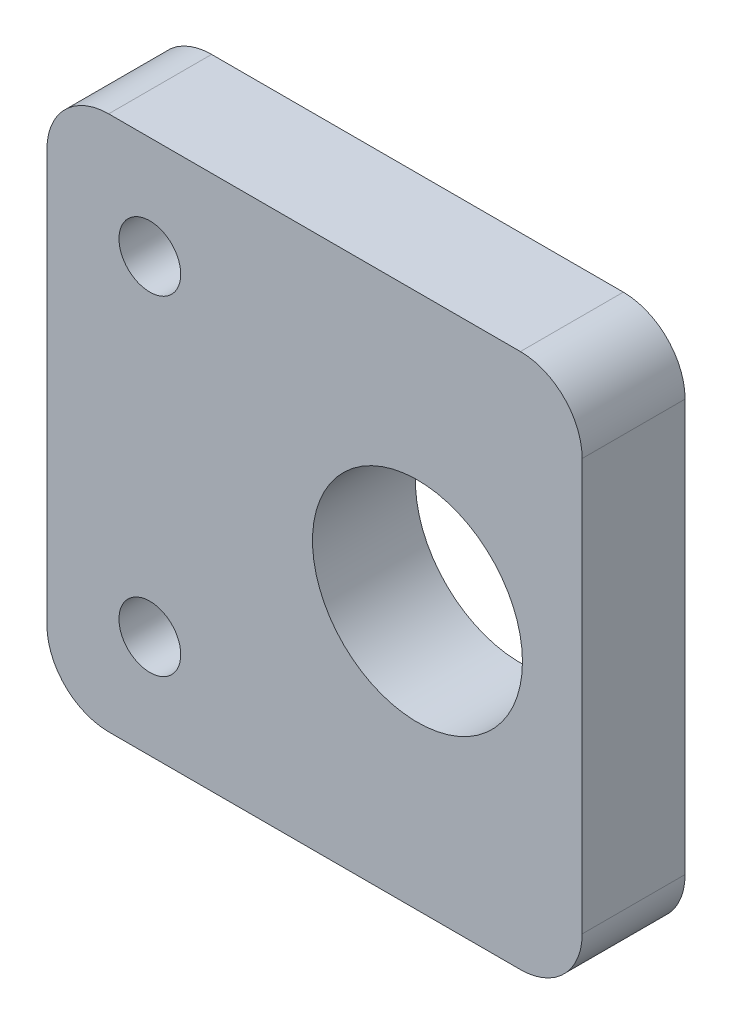
ISO-10303-21;
HEADER;
FILE_DESCRIPTION(('STEP AP214'),'2;1');
FILE_NAME('part.step','',(''),(''),'','','');
FILE_SCHEMA(('AUTOMOTIVE_DESIGN { 1 0 10303 214 1 1 1 1 }'));
ENDSEC;
DATA;
#1=APPLICATION_CONTEXT('core data for automotive mechanical design processes');
#2=APPLICATION_PROTOCOL_DEFINITION('international standard','automotive_design',2000,#1);
#3=PRODUCT_CONTEXT('',#1,'mechanical');
#4=PRODUCT('Part','Part','',(#3));
#5=PRODUCT_RELATED_PRODUCT_CATEGORY('part','',(#4));
#6=PRODUCT_DEFINITION_FORMATION('','',#4);
#7=PRODUCT_DEFINITION_CONTEXT('part definition',#1,'design');
#8=PRODUCT_DEFINITION('design','',#6,#7);
#9=PRODUCT_DEFINITION_SHAPE('','',#8);
#10=(LENGTH_UNIT() NAMED_UNIT(*) SI_UNIT(.MILLI.,.METRE.));
#11=(NAMED_UNIT(*) PLANE_ANGLE_UNIT() SI_UNIT($,.RADIAN.));
#12=(NAMED_UNIT(*) SI_UNIT($,.STERADIAN.) SOLID_ANGLE_UNIT());
#13=UNCERTAINTY_MEASURE_WITH_UNIT(LENGTH_MEASURE(1.E-05),#10,'distance_accuracy_value','');
#14=(GEOMETRIC_REPRESENTATION_CONTEXT(3) GLOBAL_UNCERTAINTY_ASSIGNED_CONTEXT((#13)) GLOBAL_UNIT_ASSIGNED_CONTEXT((#10,
#11,#12)) REPRESENTATION_CONTEXT('',''));
#15=CARTESIAN_POINT('',(0.,0.,0.));
#16=DIRECTION('',(0.,0.,1.));
#17=DIRECTION('',(1.,0.,0.));
#18=AXIS2_PLACEMENT_3D('',#15,#16,#17);
#19=CARTESIAN_POINT('',(0.,-13.,5.));
#20=DIRECTION('',(0.,1.,0.));
#21=DIRECTION('',(0.,0.,1.));
#22=AXIS2_PLACEMENT_3D('',#19,#20,#21);
#23=PLANE('',#22);
#24=DIRECTION('',(1.,0.,0.));
#25=VECTOR('',#24,1.);
#26=CARTESIAN_POINT('',(0.,-13.,5.));
#27=LINE('',#26,#25);
#28=CARTESIAN_POINT('',(-15.,-13.,5.));
#29=VERTEX_POINT('',#28);
#30=CARTESIAN_POINT('',(5.,-13.,5.));
#31=VERTEX_POINT('',#30);
#32=EDGE_CURVE('E121',#29,#31,#27,.T.);
#33=ORIENTED_EDGE('',*,*,#32,.F.);
#34=DIRECTION('',(0.,0.,-1.));
#35=VECTOR('',#34,1.);
#36=CARTESIAN_POINT('',(-15.,-13.,0.));
#37=LINE('',#36,#35);
#38=CARTESIAN_POINT('',(-15.,-13.,0.));
#39=VERTEX_POINT('',#38);
#40=EDGE_CURVE('E106',#29,#39,#37,.T.);
#41=ORIENTED_EDGE('',*,*,#40,.T.);
#42=DIRECTION('',(1.,0.,0.));
#43=VECTOR('',#42,1.);
#44=CARTESIAN_POINT('',(0.,-13.,0.));
#45=LINE('',#44,#43);
#46=CARTESIAN_POINT('',(5.,-13.,0.));
#47=VERTEX_POINT('',#46);
#48=EDGE_CURVE('E118',#39,#47,#45,.T.);
#49=ORIENTED_EDGE('',*,*,#48,.T.);
#50=DIRECTION('',(0.,0.,-1.));
#51=VECTOR('',#50,1.);
#52=CARTESIAN_POINT('',(5.,-13.,5.));
#53=LINE('',#52,#51);
#54=EDGE_CURVE('E123',#47,#31,#53,.F.);
#55=ORIENTED_EDGE('',*,*,#54,.T.);
#56=EDGE_LOOP('',(#33,#41,#49,#55));
#57=FACE_BOUND('',#56,.T.);
#58=ADVANCED_FACE('F35',(#57),#23,.F.);
#59=CARTESIAN_POINT('',(8.,0.,5.));
#60=DIRECTION('',(-1.,0.,0.));
#61=DIRECTION('',(0.,0.,1.));
#62=AXIS2_PLACEMENT_3D('',#59,#60,#61);
#63=PLANE('',#62);
#64=DIRECTION('',(0.,1.,0.));
#65=VECTOR('',#64,1.);
#66=CARTESIAN_POINT('',(8.,0.,5.));
#67=LINE('',#66,#65);
#68=CARTESIAN_POINT('',(8.,-10.,5.));
#69=VERTEX_POINT('',#68);
#70=CARTESIAN_POINT('',(8.,10.,5.));
#71=VERTEX_POINT('',#70);
#72=EDGE_CURVE('E172',#69,#71,#67,.T.);
#73=ORIENTED_EDGE('',*,*,#72,.F.);
#74=DIRECTION('',(0.,0.,-1.));
#75=VECTOR('',#74,1.);
#76=CARTESIAN_POINT('',(8.,-10.,5.));
#77=LINE('',#76,#75);
#78=CARTESIAN_POINT('',(8.,-10.,0.));
#79=VERTEX_POINT('',#78);
#80=EDGE_CURVE('E11',#69,#79,#77,.T.);
#81=ORIENTED_EDGE('',*,*,#80,.T.);
#82=DIRECTION('',(0.,1.,0.));
#83=VECTOR('',#82,1.);
#84=CARTESIAN_POINT('',(8.,0.,0.));
#85=LINE('',#84,#83);
#86=CARTESIAN_POINT('',(8.,10.,0.));
#87=VERTEX_POINT('',#86);
#88=EDGE_CURVE('E129',#79,#87,#85,.T.);
#89=ORIENTED_EDGE('',*,*,#88,.T.);
#90=DIRECTION('',(0.,0.,-1.));
#91=VECTOR('',#90,1.);
#92=CARTESIAN_POINT('',(8.,10.,5.));
#93=LINE('',#92,#91);
#94=EDGE_CURVE('E43',#87,#71,#93,.F.);
#95=ORIENTED_EDGE('',*,*,#94,.T.);
#96=EDGE_LOOP('',(#73,#81,#89,#95));
#97=FACE_BOUND('',#96,.T.);
#98=ADVANCED_FACE('F171',(#97),#63,.F.);
#99=CARTESIAN_POINT('',(0.,13.,5.));
#100=DIRECTION('',(0.,1.,0.));
#101=DIRECTION('',(-1.,0.,0.));
#102=AXIS2_PLACEMENT_3D('',#99,#100,#101);
#103=PLANE('',#102);
#104=DIRECTION('',(1.,0.,0.));
#105=VECTOR('',#104,1.);
#106=CARTESIAN_POINT('',(0.,13.,0.));
#107=LINE('',#106,#105);
#108=CARTESIAN_POINT('',(-15.,13.,0.));
#109=VERTEX_POINT('',#108);
#110=CARTESIAN_POINT('',(5.,13.,0.));
#111=VERTEX_POINT('',#110);
#112=EDGE_CURVE('E132',#109,#111,#107,.T.);
#113=ORIENTED_EDGE('',*,*,#112,.F.);
#114=DIRECTION('',(0.,0.,-1.));
#115=VECTOR('',#114,1.);
#116=CARTESIAN_POINT('',(-15.,13.,5.));
#117=LINE('',#116,#115);
#118=CARTESIAN_POINT('',(-15.,13.,5.));
#119=VERTEX_POINT('',#118);
#120=EDGE_CURVE('E57',#109,#119,#117,.F.);
#121=ORIENTED_EDGE('',*,*,#120,.T.);
#122=DIRECTION('',(1.,0.,0.));
#123=VECTOR('',#122,1.);
#124=CARTESIAN_POINT('',(0.,13.,5.));
#125=LINE('',#124,#123);
#126=CARTESIAN_POINT('',(5.,13.,5.));
#127=VERTEX_POINT('',#126);
#128=EDGE_CURVE('E179',#119,#127,#125,.T.);
#129=ORIENTED_EDGE('',*,*,#128,.T.);
#130=DIRECTION('',(0.,0.,-1.));
#131=VECTOR('',#130,1.);
#132=CARTESIAN_POINT('',(5.,13.,0.));
#133=LINE('',#132,#131);
#134=EDGE_CURVE('E165',#127,#111,#133,.T.);
#135=ORIENTED_EDGE('',*,*,#134,.T.);
#136=EDGE_LOOP('',(#113,#121,#129,#135));
#137=FACE_BOUND('',#136,.T.);
#138=ADVANCED_FACE('F182',(#137),#103,.T.);
#139=CARTESIAN_POINT('',(-13.,8.,5.));
#140=DIRECTION('',(0.,0.,-1.));
#141=DIRECTION('',(-1.,0.,0.));
#142=AXIS2_PLACEMENT_3D('',#139,#140,#141);
#143=CYLINDRICAL_SURFACE('',#142,1.5);
#144=CARTESIAN_POINT('',(-13.,8.,5.));
#145=DIRECTION('',(0.,0.,1.));
#146=DIRECTION('',(1.,0.,0.));
#147=AXIS2_PLACEMENT_3D('',#144,#145,#146);
#148=CIRCLE('',#147,1.5);
#149=CARTESIAN_POINT('',(-11.5,8.,5.));
#150=VERTEX_POINT('',#149);
#151=EDGE_CURVE('E194',#150,#150,#148,.T.);
#152=ORIENTED_EDGE('',*,*,#151,.T.);
#153=EDGE_LOOP('',(#152));
#154=FACE_BOUND('',#153,.T.);
#155=CARTESIAN_POINT('',(-13.,8.,0.));
#156=DIRECTION('',(0.,0.,1.));
#157=DIRECTION('',(1.,0.,0.));
#158=AXIS2_PLACEMENT_3D('',#155,#156,#157);
#159=CIRCLE('',#158,1.5);
#160=CARTESIAN_POINT('',(-11.5,8.,0.));
#161=VERTEX_POINT('',#160);
#162=EDGE_CURVE('E145',#161,#161,#159,.T.);
#163=ORIENTED_EDGE('',*,*,#162,.F.);
#164=EDGE_LOOP('',(#163));
#165=FACE_BOUND('',#164,.T.);
#166=ADVANCED_FACE('F283',(#154,#165),#143,.F.);
#167=CARTESIAN_POINT('',(0.,0.,5.));
#168=DIRECTION('',(0.,0.,-1.));
#169=DIRECTION('',(-1.,0.,0.));
#170=AXIS2_PLACEMENT_3D('',#167,#168,#169);
#171=CYLINDRICAL_SURFACE('',#170,5.1);
#172=CARTESIAN_POINT('',(0.,0.,5.));
#173=DIRECTION('',(0.,0.,1.));
#174=DIRECTION('',(1.,0.,0.));
#175=AXIS2_PLACEMENT_3D('',#172,#173,#174);
#176=CIRCLE('',#175,5.1);
#177=CARTESIAN_POINT('',(5.1,0.,5.));
#178=VERTEX_POINT('',#177);
#179=EDGE_CURVE('E191',#178,#178,#176,.T.);
#180=ORIENTED_EDGE('',*,*,#179,.T.);
#181=EDGE_LOOP('',(#180));
#182=FACE_BOUND('',#181,.T.);
#183=CARTESIAN_POINT('',(0.,0.,0.));
#184=DIRECTION('',(0.,0.,1.));
#185=DIRECTION('',(1.,0.,0.));
#186=AXIS2_PLACEMENT_3D('',#183,#184,#185);
#187=CIRCLE('',#186,5.1);
#188=CARTESIAN_POINT('',(5.1,0.,0.));
#189=VERTEX_POINT('',#188);
#190=EDGE_CURVE('E142',#189,#189,#187,.T.);
#191=ORIENTED_EDGE('',*,*,#190,.F.);
#192=EDGE_LOOP('',(#191));
#193=FACE_BOUND('',#192,.T.);
#194=ADVANCED_FACE('F272',(#182,#193),#171,.F.);
#195=CARTESIAN_POINT('',(-18.,0.,5.));
#196=DIRECTION('',(-1.,0.,0.));
#197=DIRECTION('',(0.,0.,1.));
#198=AXIS2_PLACEMENT_3D('',#195,#196,#197);
#199=PLANE('',#198);
#200=DIRECTION('',(0.,1.,0.));
#201=VECTOR('',#200,1.);
#202=CARTESIAN_POINT('',(-18.,0.,0.));
#203=LINE('',#202,#201);
#204=CARTESIAN_POINT('',(-18.,-10.,0.));
#205=VERTEX_POINT('',#204);
#206=CARTESIAN_POINT('',(-18.,10.,0.));
#207=VERTEX_POINT('',#206);
#208=EDGE_CURVE('E140',#205,#207,#203,.T.);
#209=ORIENTED_EDGE('',*,*,#208,.F.);
#210=DIRECTION('',(0.,0.,-1.));
#211=VECTOR('',#210,1.);
#212=CARTESIAN_POINT('',(-18.,-10.,5.));
#213=LINE('',#212,#211);
#214=CARTESIAN_POINT('',(-18.,-10.,5.));
#215=VERTEX_POINT('',#214);
#216=EDGE_CURVE('E107',#205,#215,#213,.F.);
#217=ORIENTED_EDGE('',*,*,#216,.T.);
#218=DIRECTION('',(0.,1.,0.));
#219=VECTOR('',#218,1.);
#220=CARTESIAN_POINT('',(-18.,0.,5.));
#221=LINE('',#220,#219);
#222=CARTESIAN_POINT('',(-18.,10.,5.));
#223=VERTEX_POINT('',#222);
#224=EDGE_CURVE('E190',#215,#223,#221,.T.);
#225=ORIENTED_EDGE('',*,*,#224,.T.);
#226=DIRECTION('',(0.,0.,-1.));
#227=VECTOR('',#226,1.);
#228=CARTESIAN_POINT('',(-18.,10.,5.));
#229=LINE('',#228,#227);
#230=EDGE_CURVE('E112',#223,#207,#229,.T.);
#231=ORIENTED_EDGE('',*,*,#230,.T.);
#232=EDGE_LOOP('',(#209,#217,#225,#231));
#233=FACE_BOUND('',#232,.T.);
#234=ADVANCED_FACE('F189',(#233),#199,.T.);
#235=CARTESIAN_POINT('',(-13.,-8.,5.));
#236=DIRECTION('',(0.,0.,-1.));
#237=DIRECTION('',(-1.,0.,0.));
#238=AXIS2_PLACEMENT_3D('',#235,#236,#237);
#239=CYLINDRICAL_SURFACE('',#238,1.5);
#240=CARTESIAN_POINT('',(-13.,-8.,5.));
#241=DIRECTION('',(0.,0.,1.));
#242=DIRECTION('',(1.,0.,0.));
#243=AXIS2_PLACEMENT_3D('',#240,#241,#242);
#244=CIRCLE('',#243,1.5);
#245=CARTESIAN_POINT('',(-11.5,-8.,5.));
#246=VERTEX_POINT('',#245);
#247=EDGE_CURVE('E135',#246,#246,#244,.F.);
#248=ORIENTED_EDGE('',*,*,#247,.F.);
#249=EDGE_LOOP('',(#248));
#250=FACE_BOUND('',#249,.T.);
#251=CARTESIAN_POINT('',(-13.,-8.,0.));
#252=DIRECTION('',(0.,0.,1.));
#253=DIRECTION('',(1.,0.,0.));
#254=AXIS2_PLACEMENT_3D('',#251,#252,#253);
#255=CIRCLE('',#254,1.5);
#256=CARTESIAN_POINT('',(-11.5,-8.,0.));
#257=VERTEX_POINT('',#256);
#258=EDGE_CURVE('E148',#257,#257,#255,.F.);
#259=ORIENTED_EDGE('',*,*,#258,.T.);
#260=EDGE_LOOP('',(#259));
#261=FACE_BOUND('',#260,.T.);
#262=ADVANCED_FACE('F204',(#250,#261),#239,.F.);
#263=CARTESIAN_POINT('',(0.,0.,5.));
#264=DIRECTION('',(0.,0.,1.));
#265=DIRECTION('',(1.,0.,0.));
#266=AXIS2_PLACEMENT_3D('',#263,#264,#265);
#267=PLANE('',#266);
#268=ORIENTED_EDGE('',*,*,#224,.F.);
#269=CARTESIAN_POINT('',(-15.,-10.,5.));
#270=DIRECTION('',(0.,0.,1.));
#271=DIRECTION('',(1.,0.,0.));
#272=AXIS2_PLACEMENT_3D('',#269,#270,#271);
#273=CIRCLE('',#272,3.);
#274=EDGE_CURVE('E163',#215,#29,#273,.T.);
#275=ORIENTED_EDGE('',*,*,#274,.T.);
#276=ORIENTED_EDGE('',*,*,#32,.T.);
#277=CARTESIAN_POINT('',(5.,-10.,5.));
#278=DIRECTION('',(0.,0.,1.));
#279=DIRECTION('',(1.,0.,0.));
#280=AXIS2_PLACEMENT_3D('',#277,#278,#279);
#281=CIRCLE('',#280,3.);
#282=EDGE_CURVE('E159',#31,#69,#281,.T.);
#283=ORIENTED_EDGE('',*,*,#282,.T.);
#284=ORIENTED_EDGE('',*,*,#72,.T.);
#285=CARTESIAN_POINT('',(5.,10.,5.));
#286=DIRECTION('',(0.,0.,1.));
#287=DIRECTION('',(1.,0.,0.));
#288=AXIS2_PLACEMENT_3D('',#285,#286,#287);
#289=CIRCLE('',#288,3.);
#290=EDGE_CURVE('E50',#71,#127,#289,.T.);
#291=ORIENTED_EDGE('',*,*,#290,.T.);
#292=ORIENTED_EDGE('',*,*,#128,.F.);
#293=CARTESIAN_POINT('',(-15.,10.,5.));
#294=DIRECTION('',(0.,0.,1.));
#295=DIRECTION('',(1.,0.,0.));
#296=AXIS2_PLACEMENT_3D('',#293,#294,#295);
#297=CIRCLE('',#296,3.);
#298=EDGE_CURVE('E161',#119,#223,#297,.T.);
#299=ORIENTED_EDGE('',*,*,#298,.T.);
#300=EDGE_LOOP('',(#268,#275,#276,#283,#284,#291,#292,#299));
#301=FACE_BOUND('',#300,.T.);
#302=ORIENTED_EDGE('',*,*,#179,.F.);
#303=EDGE_LOOP('',(#302));
#304=FACE_BOUND('',#303,.T.);
#305=ORIENTED_EDGE('',*,*,#151,.F.);
#306=EDGE_LOOP('',(#305));
#307=FACE_BOUND('',#306,.T.);
#308=ORIENTED_EDGE('',*,*,#247,.T.);
#309=EDGE_LOOP('',(#308));
#310=FACE_BOUND('',#309,.T.);
#311=ADVANCED_FACE('F176',(#301,#304,#307,#310),#267,.T.);
#312=CARTESIAN_POINT('',(0.,0.,0.));
#313=DIRECTION('',(0.,0.,1.));
#314=DIRECTION('',(1.,0.,0.));
#315=AXIS2_PLACEMENT_3D('',#312,#313,#314);
#316=PLANE('',#315);
#317=ORIENTED_EDGE('',*,*,#48,.F.);
#318=CARTESIAN_POINT('',(-15.,-10.,0.));
#319=DIRECTION('',(0.,0.,1.));
#320=DIRECTION('',(1.,0.,0.));
#321=AXIS2_PLACEMENT_3D('',#318,#319,#320);
#322=CIRCLE('',#321,3.);
#323=EDGE_CURVE('E102',#39,#205,#322,.F.);
#324=ORIENTED_EDGE('',*,*,#323,.T.);
#325=ORIENTED_EDGE('',*,*,#208,.T.);
#326=CARTESIAN_POINT('',(-15.,10.,0.));
#327=DIRECTION('',(0.,0.,1.));
#328=DIRECTION('',(1.,0.,0.));
#329=AXIS2_PLACEMENT_3D('',#326,#327,#328);
#330=CIRCLE('',#329,3.);
#331=EDGE_CURVE('E113',#207,#109,#330,.F.);
#332=ORIENTED_EDGE('',*,*,#331,.T.);
#333=ORIENTED_EDGE('',*,*,#112,.T.);
#334=CARTESIAN_POINT('',(5.,10.,0.));
#335=DIRECTION('',(0.,0.,1.));
#336=DIRECTION('',(1.,0.,0.));
#337=AXIS2_PLACEMENT_3D('',#334,#335,#336);
#338=CIRCLE('',#337,3.);
#339=EDGE_CURVE('E122',#111,#87,#338,.F.);
#340=ORIENTED_EDGE('',*,*,#339,.T.);
#341=ORIENTED_EDGE('',*,*,#88,.F.);
#342=CARTESIAN_POINT('',(5.,-10.,0.));
#343=DIRECTION('',(0.,0.,1.));
#344=DIRECTION('',(1.,0.,0.));
#345=AXIS2_PLACEMENT_3D('',#342,#343,#344);
#346=CIRCLE('',#345,3.);
#347=EDGE_CURVE('E128',#79,#47,#346,.F.);
#348=ORIENTED_EDGE('',*,*,#347,.T.);
#349=EDGE_LOOP('',(#317,#324,#325,#332,#333,#340,#341,#348));
#350=FACE_BOUND('',#349,.T.);
#351=ORIENTED_EDGE('',*,*,#190,.T.);
#352=EDGE_LOOP('',(#351));
#353=FACE_BOUND('',#352,.T.);
#354=ORIENTED_EDGE('',*,*,#162,.T.);
#355=EDGE_LOOP('',(#354));
#356=FACE_BOUND('',#355,.T.);
#357=ORIENTED_EDGE('',*,*,#258,.F.);
#358=EDGE_LOOP('',(#357));
#359=FACE_BOUND('',#358,.T.);
#360=ADVANCED_FACE('F125',(#350,#353,#356,#359),#316,.F.);
#361=CARTESIAN_POINT('',(-15.,-10.,5.));
#362=DIRECTION('',(0.,0.,1.));
#363=DIRECTION('',(1.,0.,0.));
#364=AXIS2_PLACEMENT_3D('',#361,#362,#363);
#365=CYLINDRICAL_SURFACE('',#364,3.);
#366=ORIENTED_EDGE('',*,*,#274,.F.);
#367=ORIENTED_EDGE('',*,*,#216,.F.);
#368=ORIENTED_EDGE('',*,*,#323,.F.);
#369=ORIENTED_EDGE('',*,*,#40,.F.);
#370=EDGE_LOOP('',(#366,#367,#368,#369));
#371=FACE_BOUND('',#370,.T.);
#372=ADVANCED_FACE('F105',(#371),#365,.T.);
#373=CARTESIAN_POINT('',(-15.,10.,5.));
#374=DIRECTION('',(0.,0.,-1.));
#375=DIRECTION('',(-1.,0.,0.));
#376=AXIS2_PLACEMENT_3D('',#373,#374,#375);
#377=CYLINDRICAL_SURFACE('',#376,3.);
#378=ORIENTED_EDGE('',*,*,#298,.F.);
#379=ORIENTED_EDGE('',*,*,#120,.F.);
#380=ORIENTED_EDGE('',*,*,#331,.F.);
#381=ORIENTED_EDGE('',*,*,#230,.F.);
#382=EDGE_LOOP('',(#378,#379,#380,#381));
#383=FACE_BOUND('',#382,.T.);
#384=ADVANCED_FACE('F186',(#383),#377,.T.);
#385=CARTESIAN_POINT('',(5.,-10.,5.));
#386=DIRECTION('',(0.,0.,-1.));
#387=DIRECTION('',(-1.,0.,0.));
#388=AXIS2_PLACEMENT_3D('',#385,#386,#387);
#389=CYLINDRICAL_SURFACE('',#388,3.);
#390=ORIENTED_EDGE('',*,*,#282,.F.);
#391=ORIENTED_EDGE('',*,*,#54,.F.);
#392=ORIENTED_EDGE('',*,*,#347,.F.);
#393=ORIENTED_EDGE('',*,*,#80,.F.);
#394=EDGE_LOOP('',(#390,#391,#392,#393));
#395=FACE_BOUND('',#394,.T.);
#396=ADVANCED_FACE('F227',(#395),#389,.T.);
#397=CARTESIAN_POINT('',(5.,10.,5.));
#398=DIRECTION('',(0.,0.,1.));
#399=DIRECTION('',(1.,0.,0.));
#400=AXIS2_PLACEMENT_3D('',#397,#398,#399);
#401=CYLINDRICAL_SURFACE('',#400,3.);
#402=ORIENTED_EDGE('',*,*,#290,.F.);
#403=ORIENTED_EDGE('',*,*,#94,.F.);
#404=ORIENTED_EDGE('',*,*,#339,.F.);
#405=ORIENTED_EDGE('',*,*,#134,.F.);
#406=EDGE_LOOP('',(#402,#403,#404,#405));
#407=FACE_BOUND('',#406,.T.);
#408=ADVANCED_FACE('F37',(#407),#401,.T.);
#409=CLOSED_SHELL('',(#58,#98,#138,#166,#194,#234,#262,#311,#360,#372,#384,#396,#408));
#410=MANIFOLD_SOLID_BREP('B2',#409);
#411=ADVANCED_BREP_SHAPE_REPRESENTATION('',(#18,#410),#14);
#412=SHAPE_DEFINITION_REPRESENTATION(#9,#411);
ENDSEC;
END-ISO-10303-21;
